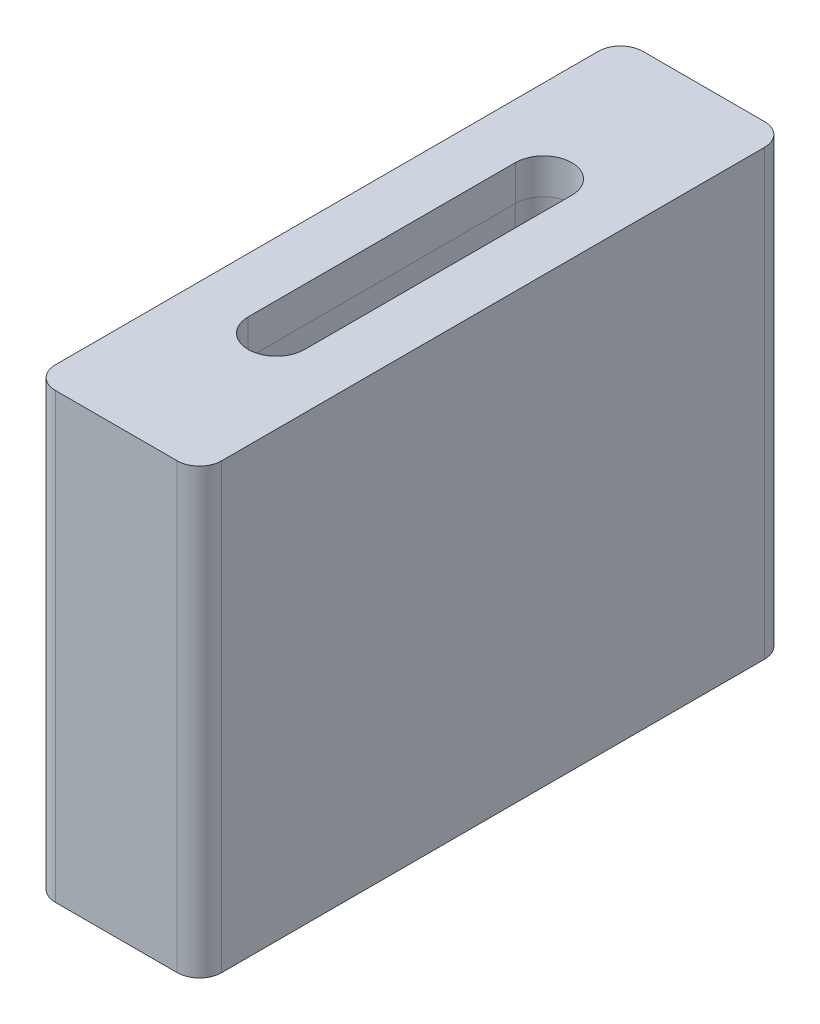
ISO-10303-21;
HEADER;
FILE_DESCRIPTION(('STEP AP214'),'2;1');
FILE_NAME('part.step','',(''),(''),'','','');
FILE_SCHEMA(('AUTOMOTIVE_DESIGN { 1 0 10303 214 1 1 1 1 }'));
ENDSEC;
DATA;
#1=APPLICATION_CONTEXT('core data for automotive mechanical design processes');
#2=APPLICATION_PROTOCOL_DEFINITION('international standard','automotive_design',2000,#1);
#3=PRODUCT_CONTEXT('',#1,'mechanical');
#4=PRODUCT('Part','Part','',(#3));
#5=PRODUCT_RELATED_PRODUCT_CATEGORY('part','',(#4));
#6=PRODUCT_DEFINITION_FORMATION('','',#4);
#7=PRODUCT_DEFINITION_CONTEXT('part definition',#1,'design');
#8=PRODUCT_DEFINITION('design','',#6,#7);
#9=PRODUCT_DEFINITION_SHAPE('','',#8);
#10=(LENGTH_UNIT() NAMED_UNIT(*) SI_UNIT(.MILLI.,.METRE.));
#11=(NAMED_UNIT(*) PLANE_ANGLE_UNIT() SI_UNIT($,.RADIAN.));
#12=(NAMED_UNIT(*) SI_UNIT($,.STERADIAN.) SOLID_ANGLE_UNIT());
#13=UNCERTAINTY_MEASURE_WITH_UNIT(LENGTH_MEASURE(1.E-05),#10,'distance_accuracy_value','');
#14=(GEOMETRIC_REPRESENTATION_CONTEXT(3) GLOBAL_UNCERTAINTY_ASSIGNED_CONTEXT((#13)) GLOBAL_UNIT_ASSIGNED_CONTEXT((#10,
#11,#12)) REPRESENTATION_CONTEXT('',''));
#15=CARTESIAN_POINT('',(0.,0.,0.));
#16=DIRECTION('',(0.,0.,1.));
#17=DIRECTION('',(1.,0.,0.));
#18=AXIS2_PLACEMENT_3D('',#15,#16,#17);
#19=CARTESIAN_POINT('',(0.,-40.001,12.05));
#20=DIRECTION('',(0.,1.,0.));
#21=DIRECTION('',(0.,0.,1.));
#22=AXIS2_PLACEMENT_3D('',#19,#20,#21);
#23=CYLINDRICAL_SURFACE('',#22,2.55);
#24=CARTESIAN_POINT('',(0.,-3.2,12.05));
#25=DIRECTION('',(0.,1.,0.));
#26=DIRECTION('',(-1.,0.,0.));
#27=AXIS2_PLACEMENT_3D('',#24,#25,#26);
#28=CIRCLE('',#27,2.55);
#29=CARTESIAN_POINT('',(-2.55,-3.2,12.05));
#30=VERTEX_POINT('',#29);
#31=CARTESIAN_POINT('',(2.55,-3.20000000000061,12.05));
#32=VERTEX_POINT('',#31);
#33=EDGE_CURVE('E75',#30,#32,#28,.T.);
#34=ORIENTED_EDGE('',*,*,#33,.F.);
#35=DIRECTION('',(0.,1.,0.));
#36=VECTOR('',#35,1.);
#37=CARTESIAN_POINT('',(-2.55,-40.001,12.05));
#38=LINE('',#37,#36);
#39=CARTESIAN_POINT('',(-2.55,0.,12.05));
#40=VERTEX_POINT('',#39);
#41=EDGE_CURVE('E238',#30,#40,#38,.T.);
#42=ORIENTED_EDGE('',*,*,#41,.T.);
#43=CARTESIAN_POINT('',(0.,0.,12.05));
#44=DIRECTION('',(0.,1.,0.));
#45=DIRECTION('',(0.,0.,1.));
#46=AXIS2_PLACEMENT_3D('',#43,#44,#45);
#47=CIRCLE('',#46,2.55);
#48=CARTESIAN_POINT('',(2.55,0.,12.05));
#49=VERTEX_POINT('',#48);
#50=EDGE_CURVE('E224',#40,#49,#47,.T.);
#51=ORIENTED_EDGE('',*,*,#50,.T.);
#52=DIRECTION('',(0.,1.,0.));
#53=VECTOR('',#52,1.);
#54=CARTESIAN_POINT('',(2.55,-40.001,12.05));
#55=LINE('',#54,#53);
#56=EDGE_CURVE('E237',#32,#49,#55,.T.);
#57=ORIENTED_EDGE('',*,*,#56,.F.);
#58=EDGE_LOOP('',(#34,#42,#51,#57));
#59=FACE_BOUND('',#58,.T.);
#60=ADVANCED_FACE('F51',(#59),#23,.F.);
#61=CARTESIAN_POINT('',(-2.55,-40.001,12.05));
#62=DIRECTION('',(-1.,0.,0.));
#63=DIRECTION('',(0.,0.,1.));
#64=AXIS2_PLACEMENT_3D('',#61,#62,#63);
#65=PLANE('',#64);
#66=DIRECTION('',(0.,0.,1.));
#67=VECTOR('',#66,1.);
#68=CARTESIAN_POINT('',(-2.55000000000001,-3.2,-12.05));
#69=LINE('',#68,#67);
#70=CARTESIAN_POINT('',(-2.55000000000001,-3.2,-12.05));
#71=VERTEX_POINT('',#70);
#72=EDGE_CURVE('E212',#71,#30,#69,.T.);
#73=ORIENTED_EDGE('',*,*,#72,.F.);
#74=DIRECTION('',(0.,1.,0.));
#75=VECTOR('',#74,1.);
#76=CARTESIAN_POINT('',(-2.55,-40.001,-12.05));
#77=LINE('',#76,#75);
#78=CARTESIAN_POINT('',(-2.55,0.,-12.05));
#79=VERTEX_POINT('',#78);
#80=EDGE_CURVE('E241',#71,#79,#77,.T.);
#81=ORIENTED_EDGE('',*,*,#80,.T.);
#82=DIRECTION('',(0.,0.,1.));
#83=VECTOR('',#82,1.);
#84=CARTESIAN_POINT('',(-2.55,0.,12.05));
#85=LINE('',#84,#83);
#86=EDGE_CURVE('E234',#79,#40,#85,.T.);
#87=ORIENTED_EDGE('',*,*,#86,.T.);
#88=ORIENTED_EDGE('',*,*,#41,.F.);
#89=EDGE_LOOP('',(#73,#81,#87,#88));
#90=FACE_BOUND('',#89,.T.);
#91=ADVANCED_FACE('F346',(#90),#65,.F.);
#92=CARTESIAN_POINT('',(0.,-40.001,-12.05));
#93=DIRECTION('',(0.,1.,0.));
#94=DIRECTION('',(0.,0.,1.));
#95=AXIS2_PLACEMENT_3D('',#92,#93,#94);
#96=CYLINDRICAL_SURFACE('',#95,2.55);
#97=CARTESIAN_POINT('',(0.,-3.2,-12.05));
#98=DIRECTION('',(0.,1.,0.));
#99=DIRECTION('',(1.,0.,0.));
#100=AXIS2_PLACEMENT_3D('',#97,#98,#99);
#101=CIRCLE('',#100,2.55);
#102=CARTESIAN_POINT('',(2.55,-3.2,-12.05));
#103=VERTEX_POINT('',#102);
#104=EDGE_CURVE('E204',#103,#71,#101,.T.);
#105=ORIENTED_EDGE('',*,*,#104,.F.);
#106=DIRECTION('',(0.,1.,0.));
#107=VECTOR('',#106,1.);
#108=CARTESIAN_POINT('',(2.55,-40.001,-12.05));
#109=LINE('',#108,#107);
#110=CARTESIAN_POINT('',(2.55,0.,-12.05));
#111=VERTEX_POINT('',#110);
#112=EDGE_CURVE('E243',#103,#111,#109,.T.);
#113=ORIENTED_EDGE('',*,*,#112,.T.);
#114=CARTESIAN_POINT('',(0.,0.,-12.05));
#115=DIRECTION('',(0.,1.,0.));
#116=DIRECTION('',(0.,0.,1.));
#117=AXIS2_PLACEMENT_3D('',#114,#115,#116);
#118=CIRCLE('',#117,2.55);
#119=EDGE_CURVE('E231',#111,#79,#118,.T.);
#120=ORIENTED_EDGE('',*,*,#119,.T.);
#121=ORIENTED_EDGE('',*,*,#80,.F.);
#122=EDGE_LOOP('',(#105,#113,#120,#121));
#123=FACE_BOUND('',#122,.T.);
#124=ADVANCED_FACE('F353',(#123),#96,.F.);
#125=CARTESIAN_POINT('',(2.55,-40.001,12.05));
#126=DIRECTION('',(1.,0.,0.));
#127=DIRECTION('',(0.,0.,-1.));
#128=AXIS2_PLACEMENT_3D('',#125,#126,#127);
#129=PLANE('',#128);
#130=DIRECTION('',(0.,0.,-1.));
#131=VECTOR('',#130,1.);
#132=CARTESIAN_POINT('',(2.55,-3.2,0.));
#133=LINE('',#132,#131);
#134=CARTESIAN_POINT('',(2.55,-3.2,0.));
#135=VERTEX_POINT('',#134);
#136=EDGE_CURVE('E196',#135,#103,#133,.T.);
#137=ORIENTED_EDGE('',*,*,#136,.F.);
#138=DIRECTION('',(0.,0.,-1.));
#139=VECTOR('',#138,1.);
#140=CARTESIAN_POINT('',(2.55,-3.2,12.05));
#141=LINE('',#140,#139);
#142=EDGE_CURVE('E221',#32,#135,#141,.T.);
#143=ORIENTED_EDGE('',*,*,#142,.F.);
#144=ORIENTED_EDGE('',*,*,#56,.T.);
#145=DIRECTION('',(0.,0.,-1.));
#146=VECTOR('',#145,1.);
#147=CARTESIAN_POINT('',(2.55,0.,12.05));
#148=LINE('',#147,#146);
#149=EDGE_CURVE('E228',#49,#111,#148,.T.);
#150=ORIENTED_EDGE('',*,*,#149,.T.);
#151=ORIENTED_EDGE('',*,*,#112,.F.);
#152=EDGE_LOOP('',(#137,#143,#144,#150,#151));
#153=FACE_BOUND('',#152,.T.);
#154=ADVANCED_FACE('F358',(#153),#129,.F.);
#155=CARTESIAN_POINT('',(-5.5,-40.,24.5));
#156=DIRECTION('',(0.,1.,0.));
#157=DIRECTION('',(0.,0.,1.));
#158=AXIS2_PLACEMENT_3D('',#155,#156,#157);
#159=CYLINDRICAL_SURFACE('',#158,2.);
#160=CARTESIAN_POINT('',(-5.5,0.,24.5));
#161=DIRECTION('',(0.,1.,0.));
#162=DIRECTION('',(0.,0.,-1.));
#163=AXIS2_PLACEMENT_3D('',#160,#161,#162);
#164=CIRCLE('',#163,2.);
#165=CARTESIAN_POINT('',(-7.5,0.,24.5));
#166=VERTEX_POINT('',#165);
#167=CARTESIAN_POINT('',(-5.5,0.,26.5));
#168=VERTEX_POINT('',#167);
#169=EDGE_CURVE('E240',#166,#168,#164,.T.);
#170=ORIENTED_EDGE('',*,*,#169,.F.);
#171=DIRECTION('',(0.,1.,0.));
#172=VECTOR('',#171,1.);
#173=CARTESIAN_POINT('',(-7.5,-40.,24.5));
#174=LINE('',#173,#172);
#175=CARTESIAN_POINT('',(-7.5,-40.,24.5));
#176=VERTEX_POINT('',#175);
#177=EDGE_CURVE('E11',#176,#166,#174,.T.);
#178=ORIENTED_EDGE('',*,*,#177,.F.);
#179=CARTESIAN_POINT('',(-5.5,-40.,24.5));
#180=DIRECTION('',(0.,1.,0.));
#181=DIRECTION('',(0.,0.,-1.));
#182=AXIS2_PLACEMENT_3D('',#179,#180,#181);
#183=CIRCLE('',#182,2.);
#184=CARTESIAN_POINT('',(-5.5,-40.,26.5));
#185=VERTEX_POINT('',#184);
#186=EDGE_CURVE('E246',#176,#185,#183,.T.);
#187=ORIENTED_EDGE('',*,*,#186,.T.);
#188=DIRECTION('',(0.,1.,0.));
#189=VECTOR('',#188,1.);
#190=CARTESIAN_POINT('',(-5.5,-40.,26.5));
#191=LINE('',#190,#189);
#192=EDGE_CURVE('E55',#185,#168,#191,.T.);
#193=ORIENTED_EDGE('',*,*,#192,.T.);
#194=EDGE_LOOP('',(#170,#178,#187,#193));
#195=FACE_BOUND('',#194,.T.);
#196=ADVANCED_FACE('F53',(#195),#159,.T.);
#197=CARTESIAN_POINT('',(-7.5,-40.,24.5));
#198=DIRECTION('',(-1.,0.,0.));
#199=DIRECTION('',(0.,0.,1.));
#200=AXIS2_PLACEMENT_3D('',#197,#198,#199);
#201=PLANE('',#200);
#202=DIRECTION('',(0.,0.,1.));
#203=VECTOR('',#202,1.);
#204=CARTESIAN_POINT('',(-7.5,0.,24.5));
#205=LINE('',#204,#203);
#206=CARTESIAN_POINT('',(-7.5,0.,-24.5));
#207=VERTEX_POINT('',#206);
#208=EDGE_CURVE('E250',#207,#166,#205,.T.);
#209=ORIENTED_EDGE('',*,*,#208,.F.);
#210=DIRECTION('',(0.,1.,0.));
#211=VECTOR('',#210,1.);
#212=CARTESIAN_POINT('',(-7.5,-40.,-24.5));
#213=LINE('',#212,#211);
#214=CARTESIAN_POINT('',(-7.5,-40.,-24.5));
#215=VERTEX_POINT('',#214);
#216=EDGE_CURVE('E60',#215,#207,#213,.T.);
#217=ORIENTED_EDGE('',*,*,#216,.F.);
#218=DIRECTION('',(0.,0.,1.));
#219=VECTOR('',#218,1.);
#220=CARTESIAN_POINT('',(-7.5,-40.,24.5));
#221=LINE('',#220,#219);
#222=EDGE_CURVE('E268',#215,#176,#221,.T.);
#223=ORIENTED_EDGE('',*,*,#222,.T.);
#224=ORIENTED_EDGE('',*,*,#177,.T.);
#225=EDGE_LOOP('',(#209,#217,#223,#224));
#226=FACE_BOUND('',#225,.T.);
#227=ADVANCED_FACE('F315',(#226),#201,.T.);
#228=CARTESIAN_POINT('',(-5.5,-40.,-24.5));
#229=DIRECTION('',(0.,1.,0.));
#230=DIRECTION('',(0.,0.,1.));
#231=AXIS2_PLACEMENT_3D('',#228,#229,#230);
#232=CYLINDRICAL_SURFACE('',#231,2.);
#233=CARTESIAN_POINT('',(-5.5,0.,-24.5));
#234=DIRECTION('',(0.,1.,0.));
#235=DIRECTION('',(0.,0.,-1.));
#236=AXIS2_PLACEMENT_3D('',#233,#234,#235);
#237=CIRCLE('',#236,2.);
#238=CARTESIAN_POINT('',(-5.5,0.,-26.5));
#239=VERTEX_POINT('',#238);
#240=EDGE_CURVE('E288',#239,#207,#237,.T.);
#241=ORIENTED_EDGE('',*,*,#240,.F.);
#242=DIRECTION('',(0.,1.,0.));
#243=VECTOR('',#242,1.);
#244=CARTESIAN_POINT('',(-5.5,-40.,-26.5));
#245=LINE('',#244,#243);
#246=CARTESIAN_POINT('',(-5.5,-40.,-26.5));
#247=VERTEX_POINT('',#246);
#248=EDGE_CURVE('E294',#247,#239,#245,.T.);
#249=ORIENTED_EDGE('',*,*,#248,.F.);
#250=CARTESIAN_POINT('',(-5.5,-40.,-24.5));
#251=DIRECTION('',(0.,1.,0.));
#252=DIRECTION('',(0.,0.,-1.));
#253=AXIS2_PLACEMENT_3D('',#250,#251,#252);
#254=CIRCLE('',#253,2.);
#255=EDGE_CURVE('E265',#247,#215,#254,.T.);
#256=ORIENTED_EDGE('',*,*,#255,.T.);
#257=ORIENTED_EDGE('',*,*,#216,.T.);
#258=EDGE_LOOP('',(#241,#249,#256,#257));
#259=FACE_BOUND('',#258,.T.);
#260=ADVANCED_FACE('F336',(#259),#232,.T.);
#261=CARTESIAN_POINT('',(-5.5,-40.,-26.5));
#262=DIRECTION('',(0.,0.,-1.));
#263=DIRECTION('',(-1.,0.,0.));
#264=AXIS2_PLACEMENT_3D('',#261,#262,#263);
#265=PLANE('',#264);
#266=DIRECTION('',(-1.,0.,0.));
#267=VECTOR('',#266,1.);
#268=CARTESIAN_POINT('',(-5.5,0.,-26.5));
#269=LINE('',#268,#267);
#270=CARTESIAN_POINT('',(5.5,0.,-26.5));
#271=VERTEX_POINT('',#270);
#272=EDGE_CURVE('E285',#271,#239,#269,.T.);
#273=ORIENTED_EDGE('',*,*,#272,.F.);
#274=DIRECTION('',(0.,1.,0.));
#275=VECTOR('',#274,1.);
#276=CARTESIAN_POINT('',(5.5,-40.,-26.5));
#277=LINE('',#276,#275);
#278=CARTESIAN_POINT('',(5.5,-40.,-26.5));
#279=VERTEX_POINT('',#278);
#280=EDGE_CURVE('E296',#279,#271,#277,.T.);
#281=ORIENTED_EDGE('',*,*,#280,.F.);
#282=DIRECTION('',(-1.,0.,0.));
#283=VECTOR('',#282,1.);
#284=CARTESIAN_POINT('',(-5.5,-40.,-26.5));
#285=LINE('',#284,#283);
#286=EDGE_CURVE('E262',#279,#247,#285,.T.);
#287=ORIENTED_EDGE('',*,*,#286,.T.);
#288=ORIENTED_EDGE('',*,*,#248,.T.);
#289=EDGE_LOOP('',(#273,#281,#287,#288));
#290=FACE_BOUND('',#289,.T.);
#291=ADVANCED_FACE('F334',(#290),#265,.T.);
#292=CARTESIAN_POINT('',(5.5,-40.,-24.5));
#293=DIRECTION('',(0.,1.,0.));
#294=DIRECTION('',(0.,0.,1.));
#295=AXIS2_PLACEMENT_3D('',#292,#293,#294);
#296=CYLINDRICAL_SURFACE('',#295,2.);
#297=CARTESIAN_POINT('',(5.5,0.,-24.5));
#298=DIRECTION('',(0.,1.,0.));
#299=DIRECTION('',(0.,0.,-1.));
#300=AXIS2_PLACEMENT_3D('',#297,#298,#299);
#301=CIRCLE('',#300,2.);
#302=CARTESIAN_POINT('',(7.5,0.,-24.5));
#303=VERTEX_POINT('',#302);
#304=EDGE_CURVE('E282',#303,#271,#301,.T.);
#305=ORIENTED_EDGE('',*,*,#304,.F.);
#306=DIRECTION('',(0.,1.,0.));
#307=VECTOR('',#306,1.);
#308=CARTESIAN_POINT('',(7.5,-40.,-24.5));
#309=LINE('',#308,#307);
#310=CARTESIAN_POINT('',(7.5,-40.,-24.5));
#311=VERTEX_POINT('',#310);
#312=EDGE_CURVE('E298',#311,#303,#309,.T.);
#313=ORIENTED_EDGE('',*,*,#312,.F.);
#314=CARTESIAN_POINT('',(5.5,-40.,-24.5));
#315=DIRECTION('',(0.,1.,0.));
#316=DIRECTION('',(0.,0.,-1.));
#317=AXIS2_PLACEMENT_3D('',#314,#315,#316);
#318=CIRCLE('',#317,2.);
#319=EDGE_CURVE('E259',#311,#279,#318,.T.);
#320=ORIENTED_EDGE('',*,*,#319,.T.);
#321=ORIENTED_EDGE('',*,*,#280,.T.);
#322=EDGE_LOOP('',(#305,#313,#320,#321));
#323=FACE_BOUND('',#322,.T.);
#324=ADVANCED_FACE('F330',(#323),#296,.T.);
#325=CARTESIAN_POINT('',(7.5,-40.,24.5));
#326=DIRECTION('',(1.,0.,0.));
#327=DIRECTION('',(0.,0.,-1.));
#328=AXIS2_PLACEMENT_3D('',#325,#326,#327);
#329=PLANE('',#328);
#330=DIRECTION('',(0.,0.,-1.));
#331=VECTOR('',#330,1.);
#332=CARTESIAN_POINT('',(7.5,0.,24.5));
#333=LINE('',#332,#331);
#334=CARTESIAN_POINT('',(7.5,0.,24.5));
#335=VERTEX_POINT('',#334);
#336=EDGE_CURVE('E279',#335,#303,#333,.T.);
#337=ORIENTED_EDGE('',*,*,#336,.F.);
#338=DIRECTION('',(0.,1.,0.));
#339=VECTOR('',#338,1.);
#340=CARTESIAN_POINT('',(7.5,-40.,24.5));
#341=LINE('',#340,#339);
#342=CARTESIAN_POINT('',(7.5,-40.,24.5));
#343=VERTEX_POINT('',#342);
#344=EDGE_CURVE('E300',#343,#335,#341,.T.);
#345=ORIENTED_EDGE('',*,*,#344,.F.);
#346=DIRECTION('',(0.,0.,-1.));
#347=VECTOR('',#346,1.);
#348=CARTESIAN_POINT('',(7.5,-40.,24.5));
#349=LINE('',#348,#347);
#350=EDGE_CURVE('E256',#343,#311,#349,.T.);
#351=ORIENTED_EDGE('',*,*,#350,.T.);
#352=ORIENTED_EDGE('',*,*,#312,.T.);
#353=EDGE_LOOP('',(#337,#345,#351,#352));
#354=FACE_BOUND('',#353,.T.);
#355=ADVANCED_FACE('F328',(#354),#329,.T.);
#356=CARTESIAN_POINT('',(5.5,-40.,24.5));
#357=DIRECTION('',(0.,1.,0.));
#358=DIRECTION('',(0.,0.,1.));
#359=AXIS2_PLACEMENT_3D('',#356,#357,#358);
#360=CYLINDRICAL_SURFACE('',#359,2.);
#361=CARTESIAN_POINT('',(5.5,0.,24.5));
#362=DIRECTION('',(0.,1.,0.));
#363=DIRECTION('',(0.,0.,1.));
#364=AXIS2_PLACEMENT_3D('',#361,#362,#363);
#365=CIRCLE('',#364,2.);
#366=CARTESIAN_POINT('',(5.5,0.,26.5));
#367=VERTEX_POINT('',#366);
#368=EDGE_CURVE('E276',#367,#335,#365,.T.);
#369=ORIENTED_EDGE('',*,*,#368,.F.);
#370=DIRECTION('',(0.,1.,0.));
#371=VECTOR('',#370,1.);
#372=CARTESIAN_POINT('',(5.5,-40.,26.5));
#373=LINE('',#372,#371);
#374=CARTESIAN_POINT('',(5.5,-40.,26.5));
#375=VERTEX_POINT('',#374);
#376=EDGE_CURVE('E301',#375,#367,#373,.T.);
#377=ORIENTED_EDGE('',*,*,#376,.F.);
#378=CARTESIAN_POINT('',(5.5,-40.,24.5));
#379=DIRECTION('',(0.,1.,0.));
#380=DIRECTION('',(0.,0.,1.));
#381=AXIS2_PLACEMENT_3D('',#378,#379,#380);
#382=CIRCLE('',#381,2.);
#383=EDGE_CURVE('E253',#375,#343,#382,.T.);
#384=ORIENTED_EDGE('',*,*,#383,.T.);
#385=ORIENTED_EDGE('',*,*,#344,.T.);
#386=EDGE_LOOP('',(#369,#377,#384,#385));
#387=FACE_BOUND('',#386,.T.);
#388=ADVANCED_FACE('F324',(#387),#360,.T.);
#389=CARTESIAN_POINT('',(-5.5,-40.,26.5));
#390=DIRECTION('',(0.,0.,1.));
#391=DIRECTION('',(1.,0.,0.));
#392=AXIS2_PLACEMENT_3D('',#389,#390,#391);
#393=PLANE('',#392);
#394=DIRECTION('',(1.,0.,0.));
#395=VECTOR('',#394,1.);
#396=CARTESIAN_POINT('',(-5.5,0.,26.5));
#397=LINE('',#396,#395);
#398=EDGE_CURVE('E273',#168,#367,#397,.T.);
#399=ORIENTED_EDGE('',*,*,#398,.F.);
#400=ORIENTED_EDGE('',*,*,#192,.F.);
#401=DIRECTION('',(1.,0.,0.));
#402=VECTOR('',#401,1.);
#403=CARTESIAN_POINT('',(-5.5,-40.,26.5));
#404=LINE('',#403,#402);
#405=EDGE_CURVE('E249',#185,#375,#404,.T.);
#406=ORIENTED_EDGE('',*,*,#405,.T.);
#407=ORIENTED_EDGE('',*,*,#376,.T.);
#408=EDGE_LOOP('',(#399,#400,#406,#407));
#409=FACE_BOUND('',#408,.T.);
#410=ADVANCED_FACE('F309',(#409),#393,.T.);
#411=CARTESIAN_POINT('',(-5.5,-40.,24.5));
#412=DIRECTION('',(0.,-1.,0.));
#413=DIRECTION('',(0.,0.,-1.));
#414=AXIS2_PLACEMENT_3D('',#411,#412,#413);
#415=PLANE('',#414);
#416=CARTESIAN_POINT('',(0.,-40.,-22.5));
#417=DIRECTION('',(0.,-1.,0.));
#418=DIRECTION('',(0.,0.,-1.));
#419=AXIS2_PLACEMENT_3D('',#416,#417,#418);
#420=CIRCLE('',#419,3.025);
#421=CARTESIAN_POINT('',(0.,-40.,-25.525));
#422=VERTEX_POINT('',#421);
#423=EDGE_CURVE('E181',#422,#422,#420,.T.);
#424=ORIENTED_EDGE('',*,*,#423,.F.);
#425=EDGE_LOOP('',(#424));
#426=FACE_BOUND('',#425,.T.);
#427=CARTESIAN_POINT('',(0.,-40.,22.5));
#428=DIRECTION('',(0.,-1.,0.));
#429=DIRECTION('',(0.,0.,-1.));
#430=AXIS2_PLACEMENT_3D('',#427,#428,#429);
#431=CIRCLE('',#430,3.025);
#432=CARTESIAN_POINT('',(0.,-40.,19.475));
#433=VERTEX_POINT('',#432);
#434=EDGE_CURVE('E174',#433,#433,#431,.T.);
#435=ORIENTED_EDGE('',*,*,#434,.F.);
#436=EDGE_LOOP('',(#435));
#437=FACE_BOUND('',#436,.T.);
#438=CARTESIAN_POINT('',(0.,-40.,12.05));
#439=DIRECTION('',(0.,1.,0.));
#440=DIRECTION('',(-1.,0.,0.));
#441=AXIS2_PLACEMENT_3D('',#438,#439,#440);
#442=CIRCLE('',#441,3.19234638935816);
#443=CARTESIAN_POINT('',(-3.19234638935816,-40.,12.05));
#444=VERTEX_POINT('',#443);
#445=CARTESIAN_POINT('',(3.19234638935816,-40.,12.05));
#446=VERTEX_POINT('',#445);
#447=EDGE_CURVE('E211',#444,#446,#442,.T.);
#448=ORIENTED_EDGE('',*,*,#447,.T.);
#449=DIRECTION('',(0.,0.,-1.));
#450=VECTOR('',#449,1.);
#451=CARTESIAN_POINT('',(3.19234638935816,-40.,12.05));
#452=LINE('',#451,#450);
#453=CARTESIAN_POINT('',(3.19234638935816,-40.,0.));
#454=VERTEX_POINT('',#453);
#455=EDGE_CURVE('E68',#446,#454,#452,.T.);
#456=ORIENTED_EDGE('',*,*,#455,.T.);
#457=DIRECTION('',(0.,0.,-1.));
#458=VECTOR('',#457,1.);
#459=CARTESIAN_POINT('',(3.19234638935816,-40.,0.));
#460=LINE('',#459,#458);
#461=CARTESIAN_POINT('',(3.19234638935816,-40.,-12.05));
#462=VERTEX_POINT('',#461);
#463=EDGE_CURVE('E192',#454,#462,#460,.T.);
#464=ORIENTED_EDGE('',*,*,#463,.T.);
#465=CARTESIAN_POINT('',(0.,-40.,-12.05));
#466=DIRECTION('',(0.,1.,0.));
#467=DIRECTION('',(1.,0.,0.));
#468=AXIS2_PLACEMENT_3D('',#465,#466,#467);
#469=CIRCLE('',#468,3.19234638935816);
#470=CARTESIAN_POINT('',(-3.19234638935817,-40.,-12.05));
#471=VERTEX_POINT('',#470);
#472=EDGE_CURVE('E198',#462,#471,#469,.T.);
#473=ORIENTED_EDGE('',*,*,#472,.T.);
#474=DIRECTION('',(0.,0.,1.));
#475=VECTOR('',#474,1.);
#476=CARTESIAN_POINT('',(-3.19234638935817,-40.,-12.05));
#477=LINE('',#476,#475);
#478=EDGE_CURVE('E206',#471,#444,#477,.T.);
#479=ORIENTED_EDGE('',*,*,#478,.T.);
#480=EDGE_LOOP('',(#448,#456,#464,#473,#479));
#481=FACE_BOUND('',#480,.T.);
#482=ORIENTED_EDGE('',*,*,#186,.F.);
#483=ORIENTED_EDGE('',*,*,#222,.F.);
#484=ORIENTED_EDGE('',*,*,#255,.F.);
#485=ORIENTED_EDGE('',*,*,#286,.F.);
#486=ORIENTED_EDGE('',*,*,#319,.F.);
#487=ORIENTED_EDGE('',*,*,#350,.F.);
#488=ORIENTED_EDGE('',*,*,#383,.F.);
#489=ORIENTED_EDGE('',*,*,#405,.F.);
#490=EDGE_LOOP('',(#482,#483,#484,#485,#486,#487,#488,#489));
#491=FACE_BOUND('',#490,.T.);
#492=ADVANCED_FACE('F318',(#426,#437,#481,#491),#415,.T.);
#493=CARTESIAN_POINT('',(-5.5,0.,24.5));
#494=DIRECTION('',(0.,-1.,0.));
#495=DIRECTION('',(0.,0.,-1.));
#496=AXIS2_PLACEMENT_3D('',#493,#494,#495);
#497=PLANE('',#496);
#498=ORIENTED_EDGE('',*,*,#149,.F.);
#499=ORIENTED_EDGE('',*,*,#50,.F.);
#500=ORIENTED_EDGE('',*,*,#86,.F.);
#501=ORIENTED_EDGE('',*,*,#119,.F.);
#502=EDGE_LOOP('',(#498,#499,#500,#501));
#503=FACE_BOUND('',#502,.T.);
#504=ORIENTED_EDGE('',*,*,#169,.T.);
#505=ORIENTED_EDGE('',*,*,#398,.T.);
#506=ORIENTED_EDGE('',*,*,#368,.T.);
#507=ORIENTED_EDGE('',*,*,#336,.T.);
#508=ORIENTED_EDGE('',*,*,#304,.T.);
#509=ORIENTED_EDGE('',*,*,#272,.T.);
#510=ORIENTED_EDGE('',*,*,#240,.T.);
#511=ORIENTED_EDGE('',*,*,#208,.T.);
#512=EDGE_LOOP('',(#504,#505,#506,#507,#508,#509,#510,#511));
#513=FACE_BOUND('',#512,.T.);
#514=ADVANCED_FACE('F311',(#503,#513),#497,.F.);
#515=CARTESIAN_POINT('',(2.55,-3.2,12.05));
#516=DIRECTION('',(-0.999847695156391,-0.0174524064372768,0.));
#517=DIRECTION('',(0.0174524064372768,-0.999847695156391,0.));
#518=AXIS2_PLACEMENT_3D('',#515,#516,#517);
#519=PLANE('',#518);
#520=DIRECTION('',(-0.0174524064372768,0.999847695156391,0.));
#521=VECTOR('',#520,1.);
#522=CARTESIAN_POINT('',(2.55,-3.2,12.05));
#523=LINE('',#522,#521);
#524=EDGE_CURVE('E216',#446,#32,#523,.T.);
#525=ORIENTED_EDGE('',*,*,#524,.T.);
#526=ORIENTED_EDGE('',*,*,#142,.T.);
#527=DIRECTION('',(-0.0174524064372768,0.999847695156391,0.));
#528=VECTOR('',#527,1.);
#529=CARTESIAN_POINT('',(2.55,-3.2,0.));
#530=LINE('',#529,#528);
#531=EDGE_CURVE('E190',#454,#135,#530,.T.);
#532=ORIENTED_EDGE('',*,*,#531,.F.);
#533=ORIENTED_EDGE('',*,*,#455,.F.);
#534=EDGE_LOOP('',(#525,#526,#532,#533));
#535=FACE_BOUND('',#534,.T.);
#536=ADVANCED_FACE('F363',(#535),#519,.T.);
#537=CARTESIAN_POINT('',(2.55,-3.2,0.));
#538=DIRECTION('',(-0.999847695156391,-0.0174524064372768,0.));
#539=DIRECTION('',(0.0174524064372768,-0.999847695156391,0.));
#540=AXIS2_PLACEMENT_3D('',#537,#538,#539);
#541=PLANE('',#540);
#542=ORIENTED_EDGE('',*,*,#136,.T.);
#543=DIRECTION('',(-0.0174524064372768,0.999847695156391,0.));
#544=VECTOR('',#543,1.);
#545=CARTESIAN_POINT('',(2.55,-3.2,-12.05));
#546=LINE('',#545,#544);
#547=EDGE_CURVE('E193',#462,#103,#546,.T.);
#548=ORIENTED_EDGE('',*,*,#547,.F.);
#549=ORIENTED_EDGE('',*,*,#463,.F.);
#550=ORIENTED_EDGE('',*,*,#531,.T.);
#551=EDGE_LOOP('',(#542,#548,#549,#550));
#552=FACE_BOUND('',#551,.T.);
#553=ADVANCED_FACE('F369',(#552),#541,.T.);
#554=CARTESIAN_POINT('',(0.,-40.,-12.05));
#555=DIRECTION('',(0.,-1.,0.));
#556=DIRECTION('',(0.,0.,-1.));
#557=AXIS2_PLACEMENT_3D('',#554,#555,#556);
#558=CONICAL_SURFACE('',#557,3.19234638935816,0.0174532925199366);
#559=ORIENTED_EDGE('',*,*,#104,.T.);
#560=DIRECTION('',(0.0174524064372768,0.999847695156391,0.));
#561=VECTOR('',#560,1.);
#562=CARTESIAN_POINT('',(-2.55000000000001,-3.2,-12.05));
#563=LINE('',#562,#561);
#564=EDGE_CURVE('E201',#471,#71,#563,.T.);
#565=ORIENTED_EDGE('',*,*,#564,.F.);
#566=ORIENTED_EDGE('',*,*,#472,.F.);
#567=ORIENTED_EDGE('',*,*,#547,.T.);
#568=EDGE_LOOP('',(#559,#565,#566,#567));
#569=FACE_BOUND('',#568,.T.);
#570=ADVANCED_FACE('F386',(#569),#558,.F.);
#571=CARTESIAN_POINT('',(-2.55000000000001,-3.2,-12.05));
#572=DIRECTION('',(0.999847695156391,-0.0174524064372768,0.));
#573=DIRECTION('',(0.0174524064372768,0.999847695156391,0.));
#574=AXIS2_PLACEMENT_3D('',#571,#572,#573);
#575=PLANE('',#574);
#576=ORIENTED_EDGE('',*,*,#72,.T.);
#577=DIRECTION('',(0.0174524064372768,0.999847695156391,0.));
#578=VECTOR('',#577,1.);
#579=CARTESIAN_POINT('',(-2.55,-3.2,12.05));
#580=LINE('',#579,#578);
#581=EDGE_CURVE('E209',#444,#30,#580,.T.);
#582=ORIENTED_EDGE('',*,*,#581,.F.);
#583=ORIENTED_EDGE('',*,*,#478,.F.);
#584=ORIENTED_EDGE('',*,*,#564,.T.);
#585=EDGE_LOOP('',(#576,#582,#583,#584));
#586=FACE_BOUND('',#585,.T.);
#587=ADVANCED_FACE('F390',(#586),#575,.T.);
#588=CARTESIAN_POINT('',(0.,-40.,12.05));
#589=DIRECTION('',(0.,-1.,0.));
#590=DIRECTION('',(0.,0.,-1.));
#591=AXIS2_PLACEMENT_3D('',#588,#589,#590);
#592=CONICAL_SURFACE('',#591,3.19234638935816,0.0174532925199366);
#593=ORIENTED_EDGE('',*,*,#33,.T.);
#594=ORIENTED_EDGE('',*,*,#524,.F.);
#595=ORIENTED_EDGE('',*,*,#447,.F.);
#596=ORIENTED_EDGE('',*,*,#581,.T.);
#597=EDGE_LOOP('',(#593,#594,#595,#596));
#598=FACE_BOUND('',#597,.T.);
#599=ADVANCED_FACE('F395',(#598),#592,.F.);
#600=CARTESIAN_POINT('',(0.,-23.,22.5));
#601=DIRECTION('',(0.,-1.,0.));
#602=DIRECTION('',(0.,0.,-1.));
#603=AXIS2_PLACEMENT_3D('',#600,#601,#602);
#604=CONICAL_SURFACE('',#603,2.5,1.02974425867665);
#605=CARTESIAN_POINT('',(0.,-21.4978484524311,22.5));
#606=VERTEX_POINT('',#605);
#607=VERTEX_LOOP('',#606);
#608=FACE_BOUND('',#607,.T.);
#609=CARTESIAN_POINT('',(0.,-23.,22.5));
#610=DIRECTION('',(0.,-1.,0.));
#611=DIRECTION('',(0.,0.,-1.));
#612=AXIS2_PLACEMENT_3D('',#609,#610,#611);
#613=CIRCLE('',#612,2.5);
#614=CARTESIAN_POINT('',(0.,-23.,20.));
#615=VERTEX_POINT('',#614);
#616=EDGE_CURVE('E187',#615,#615,#613,.T.);
#617=ORIENTED_EDGE('',*,*,#616,.T.);
#618=EDGE_LOOP('',(#617));
#619=FACE_BOUND('',#618,.T.);
#620=ADVANCED_FACE('F397',(#608,#619),#604,.F.);
#621=CARTESIAN_POINT('',(0.,-40.,22.5));
#622=DIRECTION('',(0.,-1.,0.));
#623=DIRECTION('',(0.,0.,-1.));
#624=AXIS2_PLACEMENT_3D('',#621,#622,#623);
#625=CYLINDRICAL_SURFACE('',#624,2.5);
#626=ORIENTED_EDGE('',*,*,#616,.F.);
#627=EDGE_LOOP('',(#626));
#628=FACE_BOUND('',#627,.T.);
#629=CARTESIAN_POINT('',(0.,-39.475,22.5));
#630=DIRECTION('',(0.,-1.,0.));
#631=DIRECTION('',(0.,0.,-1.));
#632=AXIS2_PLACEMENT_3D('',#629,#630,#631);
#633=CIRCLE('',#632,2.5);
#634=CARTESIAN_POINT('',(0.,-39.475,20.));
#635=VERTEX_POINT('',#634);
#636=EDGE_CURVE('E178',#635,#635,#633,.T.);
#637=ORIENTED_EDGE('',*,*,#636,.T.);
#638=EDGE_LOOP('',(#637));
#639=FACE_BOUND('',#638,.T.);
#640=ADVANCED_FACE('F403',(#628,#639),#625,.F.);
#641=CARTESIAN_POINT('',(0.,-40.,22.5));
#642=DIRECTION('',(0.,-1.,0.));
#643=DIRECTION('',(0.,0.,-1.));
#644=AXIS2_PLACEMENT_3D('',#641,#642,#643);
#645=CONICAL_SURFACE('',#644,3.025,0.785398163397452);
#646=ORIENTED_EDGE('',*,*,#636,.F.);
#647=EDGE_LOOP('',(#646));
#648=FACE_BOUND('',#647,.T.);
#649=ORIENTED_EDGE('',*,*,#434,.T.);
#650=EDGE_LOOP('',(#649));
#651=FACE_BOUND('',#650,.T.);
#652=ADVANCED_FACE('F168',(#648,#651),#645,.F.);
#653=CARTESIAN_POINT('',(0.,-23.,-22.5));
#654=DIRECTION('',(0.,-1.,0.));
#655=DIRECTION('',(0.,0.,-1.));
#656=AXIS2_PLACEMENT_3D('',#653,#654,#655);
#657=CONICAL_SURFACE('',#656,2.5,1.02974425867665);
#658=CARTESIAN_POINT('',(0.,-21.4978484524311,-22.5));
#659=VERTEX_POINT('',#658);
#660=VERTEX_LOOP('',#659);
#661=FACE_BOUND('',#660,.T.);
#662=CARTESIAN_POINT('',(0.,-23.,-22.5));
#663=DIRECTION('',(0.,-1.,0.));
#664=DIRECTION('',(0.,0.,-1.));
#665=AXIS2_PLACEMENT_3D('',#662,#663,#664);
#666=CIRCLE('',#665,2.5);
#667=CARTESIAN_POINT('',(0.,-23.,-25.));
#668=VERTEX_POINT('',#667);
#669=EDGE_CURVE('E172',#668,#668,#666,.T.);
#670=ORIENTED_EDGE('',*,*,#669,.T.);
#671=EDGE_LOOP('',(#670));
#672=FACE_BOUND('',#671,.T.);
#673=ADVANCED_FACE('F164',(#661,#672),#657,.F.);
#674=CARTESIAN_POINT('',(0.,-40.,-22.5));
#675=DIRECTION('',(0.,-1.,0.));
#676=DIRECTION('',(0.,0.,-1.));
#677=AXIS2_PLACEMENT_3D('',#674,#675,#676);
#678=CYLINDRICAL_SURFACE('',#677,2.5);
#679=ORIENTED_EDGE('',*,*,#669,.F.);
#680=EDGE_LOOP('',(#679));
#681=FACE_BOUND('',#680,.T.);
#682=CARTESIAN_POINT('',(0.,-39.475,-22.5));
#683=DIRECTION('',(0.,-1.,0.));
#684=DIRECTION('',(0.,0.,-1.));
#685=AXIS2_PLACEMENT_3D('',#682,#683,#684);
#686=CIRCLE('',#685,2.5);
#687=CARTESIAN_POINT('',(0.,-39.475,-25.));
#688=VERTEX_POINT('',#687);
#689=EDGE_CURVE('E175',#688,#688,#686,.T.);
#690=ORIENTED_EDGE('',*,*,#689,.T.);
#691=EDGE_LOOP('',(#690));
#692=FACE_BOUND('',#691,.T.);
#693=ADVANCED_FACE('F167',(#681,#692),#678,.F.);
#694=CARTESIAN_POINT('',(0.,-40.,-22.5));
#695=DIRECTION('',(0.,-1.,0.));
#696=DIRECTION('',(0.,0.,-1.));
#697=AXIS2_PLACEMENT_3D('',#694,#695,#696);
#698=CONICAL_SURFACE('',#697,3.025,0.785398163397452);
#699=ORIENTED_EDGE('',*,*,#689,.F.);
#700=EDGE_LOOP('',(#699));
#701=FACE_BOUND('',#700,.T.);
#702=ORIENTED_EDGE('',*,*,#423,.T.);
#703=EDGE_LOOP('',(#702));
#704=FACE_BOUND('',#703,.T.);
#705=ADVANCED_FACE('F566',(#701,#704),#698,.F.);
#706=CLOSED_SHELL('',(#60,#91,#124,#154,#196,#227,#260,#291,#324,#355,#388,#410,#492,#514,#536,
#553,#570,#587,#599,#620,#640,#652,#673,#693,#705));
#707=MANIFOLD_SOLID_BREP('B2',#706);
#708=ADVANCED_BREP_SHAPE_REPRESENTATION('',(#18,#707),#14);
#709=SHAPE_DEFINITION_REPRESENTATION(#9,#708);
ENDSEC;
END-ISO-10303-21;
